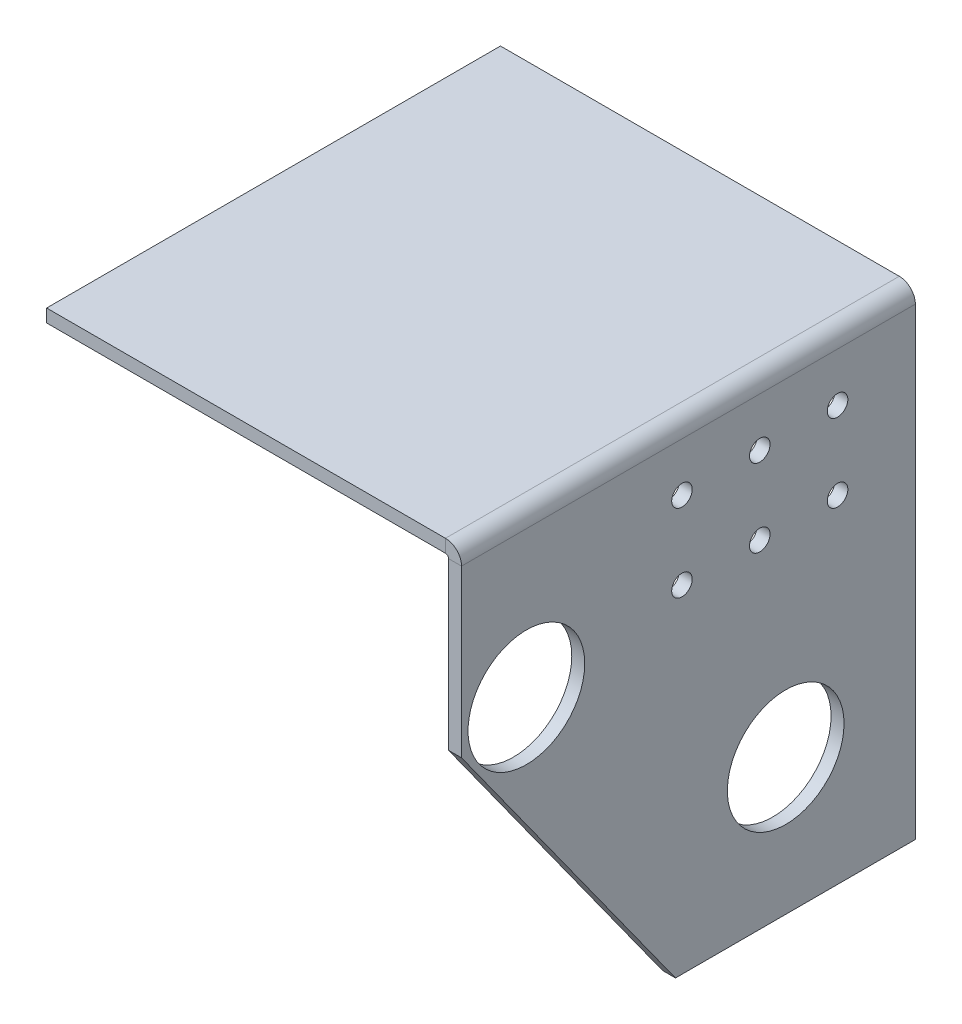
ISO-10303-21;
HEADER;
FILE_DESCRIPTION(('STEP AP214'),'2;1');
FILE_NAME('part.step','',(''),(''),'','','');
FILE_SCHEMA(('AUTOMOTIVE_DESIGN { 1 0 10303 214 1 1 1 1 }'));
ENDSEC;
DATA;
#1=APPLICATION_CONTEXT('core data for automotive mechanical design processes');
#2=APPLICATION_PROTOCOL_DEFINITION('international standard','automotive_design',2000,#1);
#3=PRODUCT_CONTEXT('',#1,'mechanical');
#4=PRODUCT('Part','Part','',(#3));
#5=PRODUCT_RELATED_PRODUCT_CATEGORY('part','',(#4));
#6=PRODUCT_DEFINITION_FORMATION('','',#4);
#7=PRODUCT_DEFINITION_CONTEXT('part definition',#1,'design');
#8=PRODUCT_DEFINITION('design','',#6,#7);
#9=PRODUCT_DEFINITION_SHAPE('','',#8);
#10=(LENGTH_UNIT() NAMED_UNIT(*) SI_UNIT(.MILLI.,.METRE.));
#11=(NAMED_UNIT(*) PLANE_ANGLE_UNIT() SI_UNIT($,.RADIAN.));
#12=(NAMED_UNIT(*) SI_UNIT($,.STERADIAN.) SOLID_ANGLE_UNIT());
#13=UNCERTAINTY_MEASURE_WITH_UNIT(LENGTH_MEASURE(1.E-05),#10,'distance_accuracy_value','');
#14=(GEOMETRIC_REPRESENTATION_CONTEXT(3) GLOBAL_UNCERTAINTY_ASSIGNED_CONTEXT((#13)) GLOBAL_UNIT_ASSIGNED_CONTEXT((#10,
#11,#12)) REPRESENTATION_CONTEXT('',''));
#15=CARTESIAN_POINT('',(0.,0.,0.));
#16=DIRECTION('',(0.,0.,1.));
#17=DIRECTION('',(1.,0.,0.));
#18=AXIS2_PLACEMENT_3D('',#15,#16,#17);
#19=CARTESIAN_POINT('',(101.6,-3.937,111.125));
#20=DIRECTION('',(0.,0.,1.));
#21=DIRECTION('',(1.,0.,0.));
#22=AXIS2_PLACEMENT_3D('',#19,#20,#21);
#23=PLANE('',#22);
#24=DIRECTION('',(-1.,0.,0.));
#25=VECTOR('',#24,1.);
#26=CARTESIAN_POINT('',(101.6,-3.937,111.125));
#27=LINE('',#26,#25);
#28=CARTESIAN_POINT('',(101.6,-3.937,111.125));
#29=VERTEX_POINT('',#28);
#30=CARTESIAN_POINT('',(98.425,-3.937,111.125));
#31=VERTEX_POINT('',#30);
#32=EDGE_CURVE('E11',#29,#31,#27,.T.);
#33=ORIENTED_EDGE('',*,*,#32,.F.);
#34=CARTESIAN_POINT('',(97.663,-3.937,111.125));
#35=DIRECTION('',(0.,0.,1.));
#36=DIRECTION('',(1.,0.,0.));
#37=AXIS2_PLACEMENT_3D('',#34,#35,#36);
#38=CIRCLE('',#37,3.937);
#39=CARTESIAN_POINT('',(97.663,0.,111.125));
#40=VERTEX_POINT('',#39);
#41=EDGE_CURVE('E145',#40,#29,#38,.F.);
#42=ORIENTED_EDGE('',*,*,#41,.F.);
#43=DIRECTION('',(0.,1.,0.));
#44=VECTOR('',#43,1.);
#45=CARTESIAN_POINT('',(97.663,-3.175,111.125));
#46=LINE('',#45,#44);
#47=CARTESIAN_POINT('',(97.663,-3.175,111.125));
#48=VERTEX_POINT('',#47);
#49=EDGE_CURVE('E52',#48,#40,#46,.T.);
#50=ORIENTED_EDGE('',*,*,#49,.F.);
#51=CARTESIAN_POINT('',(97.663,-3.937,111.125));
#52=DIRECTION('',(0.,0.,1.));
#53=DIRECTION('',(1.,0.,0.));
#54=AXIS2_PLACEMENT_3D('',#51,#52,#53);
#55=CIRCLE('',#54,0.762);
#56=EDGE_CURVE('E138',#48,#31,#55,.F.);
#57=ORIENTED_EDGE('',*,*,#56,.T.);
#58=EDGE_LOOP('',(#33,#42,#50,#57));
#59=FACE_BOUND('',#58,.T.);
#60=ADVANCED_FACE('F45',(#59),#23,.T.);
#61=CARTESIAN_POINT('',(97.663,-3.175,111.125));
#62=DIRECTION('',(0.,0.,1.));
#63=DIRECTION('',(1.,0.,0.));
#64=AXIS2_PLACEMENT_3D('',#61,#62,#63);
#65=PLANE('',#64);
#66=DIRECTION('',(1.,0.,0.));
#67=VECTOR('',#66,1.);
#68=CARTESIAN_POINT('',(0.,-44.5925899939614,111.125));
#69=LINE('',#68,#67);
#70=CARTESIAN_POINT('',(98.425,-44.5925899939614,111.125));
#71=VERTEX_POINT('',#70);
#72=CARTESIAN_POINT('',(101.6,-44.5925899939614,111.125));
#73=VERTEX_POINT('',#72);
#74=EDGE_CURVE('E564',#71,#73,#69,.T.);
#75=ORIENTED_EDGE('',*,*,#74,.T.);
#76=DIRECTION('',(0.,-1.,0.));
#77=VECTOR('',#76,1.);
#78=CARTESIAN_POINT('',(101.6,0.,111.125));
#79=LINE('',#78,#77);
#80=EDGE_CURVE('E195',#29,#73,#79,.T.);
#81=ORIENTED_EDGE('',*,*,#80,.F.);
#82=ORIENTED_EDGE('',*,*,#32,.T.);
#83=DIRECTION('',(0.,-1.,0.));
#84=VECTOR('',#83,1.);
#85=CARTESIAN_POINT('',(98.425,0.,111.125));
#86=LINE('',#85,#84);
#87=EDGE_CURVE('E171',#31,#71,#86,.T.);
#88=ORIENTED_EDGE('',*,*,#87,.T.);
#89=EDGE_LOOP('',(#75,#81,#82,#88));
#90=FACE_BOUND('',#89,.T.);
#91=ADVANCED_FACE('F204',(#90),#65,.T.);
#92=CARTESIAN_POINT('',(97.663,0.,0.));
#93=DIRECTION('',(0.,0.,-1.));
#94=DIRECTION('',(-1.,0.,0.));
#95=AXIS2_PLACEMENT_3D('',#92,#93,#94);
#96=PLANE('',#95);
#97=DIRECTION('',(0.,-1.,0.));
#98=VECTOR('',#97,1.);
#99=CARTESIAN_POINT('',(97.663,0.,0.));
#100=LINE('',#99,#98);
#101=CARTESIAN_POINT('',(97.663,0.,0.));
#102=VERTEX_POINT('',#101);
#103=CARTESIAN_POINT('',(97.663,-3.175,0.));
#104=VERTEX_POINT('',#103);
#105=EDGE_CURVE('E187',#102,#104,#100,.T.);
#106=ORIENTED_EDGE('',*,*,#105,.F.);
#107=CARTESIAN_POINT('',(97.663,-3.937,0.));
#108=DIRECTION('',(0.,0.,1.));
#109=DIRECTION('',(1.,0.,0.));
#110=AXIS2_PLACEMENT_3D('',#107,#108,#109);
#111=CIRCLE('',#110,3.937);
#112=CARTESIAN_POINT('',(101.6,-3.937,0.));
#113=VERTEX_POINT('',#112);
#114=EDGE_CURVE('E161',#102,#113,#111,.F.);
#115=ORIENTED_EDGE('',*,*,#114,.T.);
#116=DIRECTION('',(1.,0.,0.));
#117=VECTOR('',#116,1.);
#118=CARTESIAN_POINT('',(98.425,-3.937,0.));
#119=LINE('',#118,#117);
#120=CARTESIAN_POINT('',(98.425,-3.937,0.));
#121=VERTEX_POINT('',#120);
#122=EDGE_CURVE('E100',#121,#113,#119,.T.);
#123=ORIENTED_EDGE('',*,*,#122,.F.);
#124=CARTESIAN_POINT('',(97.663,-3.937,0.));
#125=DIRECTION('',(0.,0.,1.));
#126=DIRECTION('',(1.,0.,0.));
#127=AXIS2_PLACEMENT_3D('',#124,#125,#126);
#128=CIRCLE('',#127,0.762);
#129=EDGE_CURVE('E169',#104,#121,#128,.F.);
#130=ORIENTED_EDGE('',*,*,#129,.F.);
#131=EDGE_LOOP('',(#106,#115,#123,#130));
#132=FACE_BOUND('',#131,.T.);
#133=ADVANCED_FACE('F202',(#132),#96,.T.);
#134=CARTESIAN_POINT('',(98.425,-3.937,0.));
#135=DIRECTION('',(0.,0.,-1.));
#136=DIRECTION('',(-1.,0.,0.));
#137=AXIS2_PLACEMENT_3D('',#134,#135,#136);
#138=PLANE('',#137);
#139=DIRECTION('',(1.,0.,0.));
#140=VECTOR('',#139,1.);
#141=CARTESIAN_POINT('',(0.,0.,0.));
#142=LINE('',#141,#140);
#143=CARTESIAN_POINT('',(0.,0.,0.));
#144=VERTEX_POINT('',#143);
#145=EDGE_CURVE('E163',#144,#102,#142,.T.);
#146=ORIENTED_EDGE('',*,*,#145,.T.);
#147=ORIENTED_EDGE('',*,*,#105,.T.);
#148=DIRECTION('',(1.,0.,0.));
#149=VECTOR('',#148,1.);
#150=CARTESIAN_POINT('',(0.,-3.175,0.));
#151=LINE('',#150,#149);
#152=CARTESIAN_POINT('',(0.,-3.175,0.));
#153=VERTEX_POINT('',#152);
#154=EDGE_CURVE('E167',#153,#104,#151,.T.);
#155=ORIENTED_EDGE('',*,*,#154,.F.);
#156=DIRECTION('',(0.,1.,0.));
#157=VECTOR('',#156,1.);
#158=CARTESIAN_POINT('',(0.,-3.175,0.));
#159=LINE('',#158,#157);
#160=EDGE_CURVE('E124',#153,#144,#159,.T.);
#161=ORIENTED_EDGE('',*,*,#160,.T.);
#162=EDGE_LOOP('',(#146,#147,#155,#161));
#163=FACE_BOUND('',#162,.T.);
#164=ADVANCED_FACE('F198',(#163),#138,.T.);
#165=CARTESIAN_POINT('',(98.425,0.,111.125));
#166=DIRECTION('',(1.,0.,0.));
#167=DIRECTION('',(0.,1.,0.));
#168=AXIS2_PLACEMENT_3D('',#165,#166,#167);
#169=PLANE('',#168);
#170=CARTESIAN_POINT('',(98.425,-15.875,57.15));
#171=DIRECTION('',(1.,0.,0.));
#172=DIRECTION('',(0.,1.,0.));
#173=AXIS2_PLACEMENT_3D('',#170,#171,#172);
#174=CIRCLE('',#173,2.51460000000001);
#175=CARTESIAN_POINT('',(98.425,-13.3604,57.15));
#176=VERTEX_POINT('',#175);
#177=EDGE_CURVE('E155',#176,#176,#174,.T.);
#178=ORIENTED_EDGE('',*,*,#177,.T.);
#179=EDGE_LOOP('',(#178));
#180=FACE_BOUND('',#179,.T.);
#181=CARTESIAN_POINT('',(98.425,-34.925,38.1));
#182=DIRECTION('',(1.,0.,0.));
#183=DIRECTION('',(0.,1.,0.));
#184=AXIS2_PLACEMENT_3D('',#181,#182,#183);
#185=CIRCLE('',#184,2.51460000000001);
#186=CARTESIAN_POINT('',(98.425,-32.4104,38.1));
#187=VERTEX_POINT('',#186);
#188=EDGE_CURVE('E518',#187,#187,#185,.T.);
#189=ORIENTED_EDGE('',*,*,#188,.T.);
#190=EDGE_LOOP('',(#189));
#191=FACE_BOUND('',#190,.T.);
#192=CARTESIAN_POINT('',(98.425,-15.875,38.1));
#193=DIRECTION('',(1.,0.,0.));
#194=DIRECTION('',(0.,1.,0.));
#195=AXIS2_PLACEMENT_3D('',#192,#193,#194);
#196=CIRCLE('',#195,2.51460000000001);
#197=CARTESIAN_POINT('',(98.425,-13.3604,38.1));
#198=VERTEX_POINT('',#197);
#199=EDGE_CURVE('E521',#198,#198,#196,.T.);
#200=ORIENTED_EDGE('',*,*,#199,.T.);
#201=EDGE_LOOP('',(#200));
#202=FACE_BOUND('',#201,.T.);
#203=CARTESIAN_POINT('',(98.425,-39.6875,95.25));
#204=DIRECTION('',(1.,0.,0.));
#205=DIRECTION('',(0.,1.,0.));
#206=AXIS2_PLACEMENT_3D('',#203,#204,#205);
#207=CIRCLE('',#206,14.2875);
#208=CARTESIAN_POINT('',(98.425,-25.4,95.25));
#209=VERTEX_POINT('',#208);
#210=EDGE_CURVE('E524',#209,#209,#207,.T.);
#211=ORIENTED_EDGE('',*,*,#210,.T.);
#212=EDGE_LOOP('',(#211));
#213=FACE_BOUND('',#212,.T.);
#214=CARTESIAN_POINT('',(98.425,-34.925,19.05));
#215=DIRECTION('',(1.,0.,0.));
#216=DIRECTION('',(0.,1.,0.));
#217=AXIS2_PLACEMENT_3D('',#214,#215,#216);
#218=CIRCLE('',#217,2.51460000000001);
#219=CARTESIAN_POINT('',(98.425,-32.4104,19.05));
#220=VERTEX_POINT('',#219);
#221=EDGE_CURVE('E528',#220,#220,#218,.T.);
#222=ORIENTED_EDGE('',*,*,#221,.T.);
#223=EDGE_LOOP('',(#222));
#224=FACE_BOUND('',#223,.T.);
#225=CARTESIAN_POINT('',(98.425,-15.875,19.05));
#226=DIRECTION('',(1.,0.,0.));
#227=DIRECTION('',(0.,1.,0.));
#228=AXIS2_PLACEMENT_3D('',#225,#226,#227);
#229=CIRCLE('',#228,2.51460000000001);
#230=CARTESIAN_POINT('',(98.425,-13.3604,19.05));
#231=VERTEX_POINT('',#230);
#232=EDGE_CURVE('E531',#231,#231,#229,.T.);
#233=ORIENTED_EDGE('',*,*,#232,.T.);
#234=EDGE_LOOP('',(#233));
#235=FACE_BOUND('',#234,.T.);
#236=CARTESIAN_POINT('',(98.425,-34.925,57.15));
#237=DIRECTION('',(1.,0.,0.));
#238=DIRECTION('',(0.,1.,0.));
#239=AXIS2_PLACEMENT_3D('',#236,#237,#238);
#240=CIRCLE('',#239,2.51460000000001);
#241=CARTESIAN_POINT('',(98.425,-32.4104,57.15));
#242=VERTEX_POINT('',#241);
#243=EDGE_CURVE('E534',#242,#242,#240,.T.);
#244=ORIENTED_EDGE('',*,*,#243,.T.);
#245=EDGE_LOOP('',(#244));
#246=FACE_BOUND('',#245,.T.);
#247=CARTESIAN_POINT('',(98.425,-84.1375,31.75));
#248=DIRECTION('',(1.,0.,0.));
#249=DIRECTION('',(0.,1.,0.));
#250=AXIS2_PLACEMENT_3D('',#247,#248,#249);
#251=CIRCLE('',#250,14.2875);
#252=CARTESIAN_POINT('',(98.425,-69.85,31.75));
#253=VERTEX_POINT('',#252);
#254=EDGE_CURVE('E537',#253,#253,#251,.T.);
#255=ORIENTED_EDGE('',*,*,#254,.T.);
#256=EDGE_LOOP('',(#255));
#257=FACE_BOUND('',#256,.T.);
#258=DIRECTION('',(0.,0.,-1.));
#259=VECTOR('',#258,1.);
#260=CARTESIAN_POINT('',(98.425,-117.475,111.125));
#261=LINE('',#260,#259);
#262=CARTESIAN_POINT('',(98.425,-117.475,58.7374999999999));
#263=VERTEX_POINT('',#262);
#264=CARTESIAN_POINT('',(98.425,-117.475,0.));
#265=VERTEX_POINT('',#264);
#266=EDGE_CURVE('E184',#263,#265,#261,.T.);
#267=ORIENTED_EDGE('',*,*,#266,.F.);
#268=DIRECTION('',(0.,0.811998116772744,0.583660053762049));
#269=VECTOR('',#268,1.);
#270=CARTESIAN_POINT('',(98.425,-15.1908697170658,132.258804725698));
#271=LINE('',#270,#269);
#272=EDGE_CURVE('E510',#263,#71,#271,.T.);
#273=ORIENTED_EDGE('',*,*,#272,.T.);
#274=ORIENTED_EDGE('',*,*,#87,.F.);
#275=DIRECTION('',(0.,0.,-1.));
#276=VECTOR('',#275,1.);
#277=CARTESIAN_POINT('',(98.425,-3.937,111.125));
#278=LINE('',#277,#276);
#279=EDGE_CURVE('E150',#31,#121,#278,.T.);
#280=ORIENTED_EDGE('',*,*,#279,.T.);
#281=DIRECTION('',(0.,-1.,0.));
#282=VECTOR('',#281,1.);
#283=CARTESIAN_POINT('',(98.425,0.,0.));
#284=LINE('',#283,#282);
#285=EDGE_CURVE('E151',#121,#265,#284,.T.);
#286=ORIENTED_EDGE('',*,*,#285,.T.);
#287=EDGE_LOOP('',(#267,#273,#274,#280,#286));
#288=FACE_BOUND('',#287,.T.);
#289=ADVANCED_FACE('F210',(#180,#191,#202,#213,#224,#235,#246,#257,#288),#169,.F.);
#290=CARTESIAN_POINT('',(101.6,-117.475,111.125));
#291=DIRECTION('',(0.,-1.,0.));
#292=DIRECTION('',(0.,0.,-1.));
#293=AXIS2_PLACEMENT_3D('',#290,#291,#292);
#294=PLANE('',#293);
#295=DIRECTION('',(1.,0.,0.));
#296=VECTOR('',#295,1.);
#297=CARTESIAN_POINT('',(0.,-117.475,58.7374999999999));
#298=LINE('',#297,#296);
#299=CARTESIAN_POINT('',(101.6,-117.475,58.7374999999999));
#300=VERTEX_POINT('',#299);
#301=EDGE_CURVE('E59',#263,#300,#298,.T.);
#302=ORIENTED_EDGE('',*,*,#301,.F.);
#303=ORIENTED_EDGE('',*,*,#266,.T.);
#304=DIRECTION('',(-1.,0.,0.));
#305=VECTOR('',#304,1.);
#306=CARTESIAN_POINT('',(101.6,-117.475,0.));
#307=LINE('',#306,#305);
#308=CARTESIAN_POINT('',(101.6,-117.475,0.));
#309=VERTEX_POINT('',#308);
#310=EDGE_CURVE('E154',#309,#265,#307,.T.);
#311=ORIENTED_EDGE('',*,*,#310,.F.);
#312=DIRECTION('',(0.,0.,-1.));
#313=VECTOR('',#312,1.);
#314=CARTESIAN_POINT('',(101.6,-117.475,111.125));
#315=LINE('',#314,#313);
#316=EDGE_CURVE('E182',#300,#309,#315,.T.);
#317=ORIENTED_EDGE('',*,*,#316,.F.);
#318=EDGE_LOOP('',(#302,#303,#311,#317));
#319=FACE_BOUND('',#318,.T.);
#320=ADVANCED_FACE('F236',(#319),#294,.T.);
#321=CARTESIAN_POINT('',(101.6,0.,111.125));
#322=DIRECTION('',(1.,0.,0.));
#323=DIRECTION('',(0.,1.,0.));
#324=AXIS2_PLACEMENT_3D('',#321,#322,#323);
#325=PLANE('',#324);
#326=CARTESIAN_POINT('',(101.6,-15.875,57.15));
#327=DIRECTION('',(1.,0.,0.));
#328=DIRECTION('',(0.,0.,-1.));
#329=AXIS2_PLACEMENT_3D('',#326,#327,#328);
#330=CIRCLE('',#329,2.51460000000001);
#331=CARTESIAN_POINT('',(101.6,-15.875,54.6354));
#332=VERTEX_POINT('',#331);
#333=EDGE_CURVE('E550',#332,#332,#330,.T.);
#334=ORIENTED_EDGE('',*,*,#333,.F.);
#335=EDGE_LOOP('',(#334));
#336=FACE_BOUND('',#335,.T.);
#337=CARTESIAN_POINT('',(101.6,-34.925,38.1));
#338=DIRECTION('',(1.,0.,0.));
#339=DIRECTION('',(0.,0.,-1.));
#340=AXIS2_PLACEMENT_3D('',#337,#338,#339);
#341=CIRCLE('',#340,2.51460000000001);
#342=CARTESIAN_POINT('',(101.6,-34.925,35.5854));
#343=VERTEX_POINT('',#342);
#344=EDGE_CURVE('E547',#343,#343,#341,.T.);
#345=ORIENTED_EDGE('',*,*,#344,.F.);
#346=EDGE_LOOP('',(#345));
#347=FACE_BOUND('',#346,.T.);
#348=CARTESIAN_POINT('',(101.6,-15.875,38.1));
#349=DIRECTION('',(1.,0.,0.));
#350=DIRECTION('',(0.,0.,-1.));
#351=AXIS2_PLACEMENT_3D('',#348,#349,#350);
#352=CIRCLE('',#351,2.51460000000001);
#353=CARTESIAN_POINT('',(101.6,-15.875,35.5854));
#354=VERTEX_POINT('',#353);
#355=EDGE_CURVE('E544',#354,#354,#352,.T.);
#356=ORIENTED_EDGE('',*,*,#355,.F.);
#357=EDGE_LOOP('',(#356));
#358=FACE_BOUND('',#357,.T.);
#359=CARTESIAN_POINT('',(101.6,-39.6875,95.25));
#360=DIRECTION('',(1.,0.,0.));
#361=DIRECTION('',(0.,0.,-1.));
#362=AXIS2_PLACEMENT_3D('',#359,#360,#361);
#363=CIRCLE('',#362,14.2875);
#364=CARTESIAN_POINT('',(101.6,-39.6875,80.9625));
#365=VERTEX_POINT('',#364);
#366=EDGE_CURVE('E543',#365,#365,#363,.T.);
#367=ORIENTED_EDGE('',*,*,#366,.F.);
#368=EDGE_LOOP('',(#367));
#369=FACE_BOUND('',#368,.T.);
#370=DIRECTION('',(0.,0.811998116772744,0.583660053762049));
#371=VECTOR('',#370,1.);
#372=CARTESIAN_POINT('',(101.6,-117.475,58.7374999999999));
#373=LINE('',#372,#371);
#374=EDGE_CURVE('E562',#300,#73,#373,.T.);
#375=ORIENTED_EDGE('',*,*,#374,.F.);
#376=ORIENTED_EDGE('',*,*,#316,.T.);
#377=DIRECTION('',(0.,-1.,0.));
#378=VECTOR('',#377,1.);
#379=CARTESIAN_POINT('',(101.6,0.,0.));
#380=LINE('',#379,#378);
#381=EDGE_CURVE('E158',#113,#309,#380,.T.);
#382=ORIENTED_EDGE('',*,*,#381,.F.);
#383=DIRECTION('',(0.,0.,-1.));
#384=VECTOR('',#383,1.);
#385=CARTESIAN_POINT('',(101.6,-3.937,111.125));
#386=LINE('',#385,#384);
#387=EDGE_CURVE('E179',#29,#113,#386,.T.);
#388=ORIENTED_EDGE('',*,*,#387,.F.);
#389=ORIENTED_EDGE('',*,*,#80,.T.);
#390=EDGE_LOOP('',(#375,#376,#382,#388,#389));
#391=FACE_BOUND('',#390,.T.);
#392=CARTESIAN_POINT('',(101.6,-34.925,19.05));
#393=DIRECTION('',(1.,0.,0.));
#394=DIRECTION('',(0.,0.,-1.));
#395=AXIS2_PLACEMENT_3D('',#392,#393,#394);
#396=CIRCLE('',#395,2.51460000000001);
#397=CARTESIAN_POINT('',(101.6,-34.925,16.5354));
#398=VERTEX_POINT('',#397);
#399=EDGE_CURVE('E559',#398,#398,#396,.T.);
#400=ORIENTED_EDGE('',*,*,#399,.F.);
#401=EDGE_LOOP('',(#400));
#402=FACE_BOUND('',#401,.T.);
#403=CARTESIAN_POINT('',(101.6,-15.875,19.05));
#404=DIRECTION('',(1.,0.,0.));
#405=DIRECTION('',(0.,0.,-1.));
#406=AXIS2_PLACEMENT_3D('',#403,#404,#405);
#407=CIRCLE('',#406,2.51460000000001);
#408=CARTESIAN_POINT('',(101.6,-15.875,16.5354));
#409=VERTEX_POINT('',#408);
#410=EDGE_CURVE('E556',#409,#409,#407,.T.);
#411=ORIENTED_EDGE('',*,*,#410,.F.);
#412=EDGE_LOOP('',(#411));
#413=FACE_BOUND('',#412,.T.);
#414=CARTESIAN_POINT('',(101.6,-34.925,57.15));
#415=DIRECTION('',(1.,0.,0.));
#416=DIRECTION('',(0.,0.,-1.));
#417=AXIS2_PLACEMENT_3D('',#414,#415,#416);
#418=CIRCLE('',#417,2.51460000000001);
#419=CARTESIAN_POINT('',(101.6,-34.925,54.6354));
#420=VERTEX_POINT('',#419);
#421=EDGE_CURVE('E553',#420,#420,#418,.T.);
#422=ORIENTED_EDGE('',*,*,#421,.F.);
#423=EDGE_LOOP('',(#422));
#424=FACE_BOUND('',#423,.T.);
#425=CARTESIAN_POINT('',(101.6,-84.1375,31.75));
#426=DIRECTION('',(1.,0.,0.));
#427=DIRECTION('',(0.,0.,-1.));
#428=AXIS2_PLACEMENT_3D('',#425,#426,#427);
#429=CIRCLE('',#428,14.2875);
#430=CARTESIAN_POINT('',(101.6,-84.1375,17.4625));
#431=VERTEX_POINT('',#430);
#432=EDGE_CURVE('E540',#431,#431,#429,.T.);
#433=ORIENTED_EDGE('',*,*,#432,.F.);
#434=EDGE_LOOP('',(#433));
#435=FACE_BOUND('',#434,.T.);
#436=ADVANCED_FACE('F248',(#336,#347,#358,#369,#391,#402,#413,#424,#435),#325,.T.);
#437=CARTESIAN_POINT('',(97.663,-3.937,111.125));
#438=DIRECTION('',(0.,0.,-1.));
#439=DIRECTION('',(-1.,0.,0.));
#440=AXIS2_PLACEMENT_3D('',#437,#438,#439);
#441=CYLINDRICAL_SURFACE('',#440,3.937);
#442=ORIENTED_EDGE('',*,*,#114,.F.);
#443=DIRECTION('',(0.,0.,-1.));
#444=VECTOR('',#443,1.);
#445=CARTESIAN_POINT('',(97.663,0.,111.125));
#446=LINE('',#445,#444);
#447=EDGE_CURVE('E176',#40,#102,#446,.T.);
#448=ORIENTED_EDGE('',*,*,#447,.F.);
#449=ORIENTED_EDGE('',*,*,#41,.T.);
#450=ORIENTED_EDGE('',*,*,#387,.T.);
#451=EDGE_LOOP('',(#442,#448,#449,#450));
#452=FACE_BOUND('',#451,.T.);
#453=ADVANCED_FACE('F192',(#452),#441,.T.);
#454=CARTESIAN_POINT('',(0.,0.,111.125));
#455=DIRECTION('',(0.,1.,0.));
#456=DIRECTION('',(0.,0.,1.));
#457=AXIS2_PLACEMENT_3D('',#454,#455,#456);
#458=PLANE('',#457);
#459=ORIENTED_EDGE('',*,*,#145,.F.);
#460=DIRECTION('',(0.,0.,-1.));
#461=VECTOR('',#460,1.);
#462=CARTESIAN_POINT('',(0.,0.,111.125));
#463=LINE('',#462,#461);
#464=CARTESIAN_POINT('',(0.,0.,111.125));
#465=VERTEX_POINT('',#464);
#466=EDGE_CURVE('E128',#465,#144,#463,.T.);
#467=ORIENTED_EDGE('',*,*,#466,.F.);
#468=DIRECTION('',(1.,0.,0.));
#469=VECTOR('',#468,1.);
#470=CARTESIAN_POINT('',(0.,0.,111.125));
#471=LINE('',#470,#469);
#472=EDGE_CURVE('E143',#465,#40,#471,.T.);
#473=ORIENTED_EDGE('',*,*,#472,.T.);
#474=ORIENTED_EDGE('',*,*,#447,.T.);
#475=EDGE_LOOP('',(#459,#467,#473,#474));
#476=FACE_BOUND('',#475,.T.);
#477=ADVANCED_FACE('F196',(#476),#458,.T.);
#478=CARTESIAN_POINT('',(0.,-3.175,111.125));
#479=DIRECTION('',(-1.,0.,0.));
#480=DIRECTION('',(0.,0.,1.));
#481=AXIS2_PLACEMENT_3D('',#478,#479,#480);
#482=PLANE('',#481);
#483=ORIENTED_EDGE('',*,*,#160,.F.);
#484=DIRECTION('',(0.,0.,-1.));
#485=VECTOR('',#484,1.);
#486=CARTESIAN_POINT('',(0.,-3.175,111.125));
#487=LINE('',#486,#485);
#488=CARTESIAN_POINT('',(0.,-3.175,111.125));
#489=VERTEX_POINT('',#488);
#490=EDGE_CURVE('E118',#489,#153,#487,.T.);
#491=ORIENTED_EDGE('',*,*,#490,.F.);
#492=DIRECTION('',(0.,1.,0.));
#493=VECTOR('',#492,1.);
#494=CARTESIAN_POINT('',(0.,-3.175,111.125));
#495=LINE('',#494,#493);
#496=EDGE_CURVE('E122',#489,#465,#495,.T.);
#497=ORIENTED_EDGE('',*,*,#496,.T.);
#498=ORIENTED_EDGE('',*,*,#466,.T.);
#499=EDGE_LOOP('',(#483,#491,#497,#498));
#500=FACE_BOUND('',#499,.T.);
#501=ADVANCED_FACE('F120',(#500),#482,.T.);
#502=CARTESIAN_POINT('',(0.,-3.175,111.125));
#503=DIRECTION('',(0.,1.,0.));
#504=DIRECTION('',(0.,0.,1.));
#505=AXIS2_PLACEMENT_3D('',#502,#503,#504);
#506=PLANE('',#505);
#507=ORIENTED_EDGE('',*,*,#154,.T.);
#508=DIRECTION('',(0.,0.,-1.));
#509=VECTOR('',#508,1.);
#510=CARTESIAN_POINT('',(97.663,-3.175,111.125));
#511=LINE('',#510,#509);
#512=EDGE_CURVE('E129',#48,#104,#511,.T.);
#513=ORIENTED_EDGE('',*,*,#512,.F.);
#514=DIRECTION('',(1.,0.,0.));
#515=VECTOR('',#514,1.);
#516=CARTESIAN_POINT('',(0.,-3.175,111.125));
#517=LINE('',#516,#515);
#518=EDGE_CURVE('E133',#489,#48,#517,.T.);
#519=ORIENTED_EDGE('',*,*,#518,.F.);
#520=ORIENTED_EDGE('',*,*,#490,.T.);
#521=EDGE_LOOP('',(#507,#513,#519,#520));
#522=FACE_BOUND('',#521,.T.);
#523=ADVANCED_FACE('F134',(#522),#506,.F.);
#524=CARTESIAN_POINT('',(97.663,-3.937,111.125));
#525=DIRECTION('',(0.,0.,-1.));
#526=DIRECTION('',(-1.,0.,0.));
#527=AXIS2_PLACEMENT_3D('',#524,#525,#526);
#528=CYLINDRICAL_SURFACE('',#527,0.762);
#529=ORIENTED_EDGE('',*,*,#129,.T.);
#530=ORIENTED_EDGE('',*,*,#279,.F.);
#531=ORIENTED_EDGE('',*,*,#56,.F.);
#532=ORIENTED_EDGE('',*,*,#512,.T.);
#533=EDGE_LOOP('',(#529,#530,#531,#532));
#534=FACE_BOUND('',#533,.T.);
#535=ADVANCED_FACE('F200',(#534),#528,.F.);
#536=CARTESIAN_POINT('',(97.663,-3.937,111.125));
#537=DIRECTION('',(0.,0.,1.));
#538=DIRECTION('',(1.,0.,0.));
#539=AXIS2_PLACEMENT_3D('',#536,#537,#538);
#540=PLANE('',#539);
#541=ORIENTED_EDGE('',*,*,#518,.T.);
#542=ORIENTED_EDGE('',*,*,#49,.T.);
#543=ORIENTED_EDGE('',*,*,#472,.F.);
#544=ORIENTED_EDGE('',*,*,#496,.F.);
#545=EDGE_LOOP('',(#541,#542,#543,#544));
#546=FACE_BOUND('',#545,.T.);
#547=ADVANCED_FACE('F141',(#546),#540,.T.);
#548=CARTESIAN_POINT('',(97.663,-3.937,0.));
#549=DIRECTION('',(0.,0.,1.));
#550=DIRECTION('',(1.,0.,0.));
#551=AXIS2_PLACEMENT_3D('',#548,#549,#550);
#552=PLANE('',#551);
#553=ORIENTED_EDGE('',*,*,#285,.F.);
#554=ORIENTED_EDGE('',*,*,#122,.T.);
#555=ORIENTED_EDGE('',*,*,#381,.T.);
#556=ORIENTED_EDGE('',*,*,#310,.T.);
#557=EDGE_LOOP('',(#553,#554,#555,#556));
#558=FACE_BOUND('',#557,.T.);
#559=ADVANCED_FACE('F227',(#558),#552,.F.);
#560=CARTESIAN_POINT('',(0.,-84.1375,31.75));
#561=DIRECTION('',(1.,0.,0.));
#562=DIRECTION('',(0.,0.,-1.));
#563=AXIS2_PLACEMENT_3D('',#560,#561,#562);
#564=CYLINDRICAL_SURFACE('',#563,14.2875);
#565=ORIENTED_EDGE('',*,*,#432,.T.);
#566=EDGE_LOOP('',(#565));
#567=FACE_BOUND('',#566,.T.);
#568=ORIENTED_EDGE('',*,*,#254,.F.);
#569=EDGE_LOOP('',(#568));
#570=FACE_BOUND('',#569,.T.);
#571=ADVANCED_FACE('F267',(#567,#570),#564,.F.);
#572=CARTESIAN_POINT('',(0.,-34.925,57.15));
#573=DIRECTION('',(1.,0.,0.));
#574=DIRECTION('',(0.,0.,-1.));
#575=AXIS2_PLACEMENT_3D('',#572,#573,#574);
#576=CYLINDRICAL_SURFACE('',#575,2.51460000000001);
#577=ORIENTED_EDGE('',*,*,#421,.T.);
#578=EDGE_LOOP('',(#577));
#579=FACE_BOUND('',#578,.T.);
#580=ORIENTED_EDGE('',*,*,#243,.F.);
#581=EDGE_LOOP('',(#580));
#582=FACE_BOUND('',#581,.T.);
#583=ADVANCED_FACE('F272',(#579,#582),#576,.F.);
#584=CARTESIAN_POINT('',(0.,-15.875,19.05));
#585=DIRECTION('',(1.,0.,0.));
#586=DIRECTION('',(0.,0.,-1.));
#587=AXIS2_PLACEMENT_3D('',#584,#585,#586);
#588=CYLINDRICAL_SURFACE('',#587,2.51460000000001);
#589=ORIENTED_EDGE('',*,*,#410,.T.);
#590=EDGE_LOOP('',(#589));
#591=FACE_BOUND('',#590,.T.);
#592=ORIENTED_EDGE('',*,*,#232,.F.);
#593=EDGE_LOOP('',(#592));
#594=FACE_BOUND('',#593,.T.);
#595=ADVANCED_FACE('F283',(#591,#594),#588,.F.);
#596=CARTESIAN_POINT('',(0.,-34.925,19.05));
#597=DIRECTION('',(1.,0.,0.));
#598=DIRECTION('',(0.,0.,-1.));
#599=AXIS2_PLACEMENT_3D('',#596,#597,#598);
#600=CYLINDRICAL_SURFACE('',#599,2.51460000000001);
#601=ORIENTED_EDGE('',*,*,#399,.T.);
#602=EDGE_LOOP('',(#601));
#603=FACE_BOUND('',#602,.T.);
#604=ORIENTED_EDGE('',*,*,#221,.F.);
#605=EDGE_LOOP('',(#604));
#606=FACE_BOUND('',#605,.T.);
#607=ADVANCED_FACE('F294',(#603,#606),#600,.F.);
#608=CARTESIAN_POINT('',(0.,-117.475,58.7374999999999));
#609=DIRECTION('',(0.,0.583660053762049,-0.811998116772744));
#610=DIRECTION('',(0.,0.811998116772744,0.583660053762049));
#611=AXIS2_PLACEMENT_3D('',#608,#609,#610);
#612=PLANE('',#611);
#613=ORIENTED_EDGE('',*,*,#301,.T.);
#614=ORIENTED_EDGE('',*,*,#374,.T.);
#615=ORIENTED_EDGE('',*,*,#74,.F.);
#616=ORIENTED_EDGE('',*,*,#272,.F.);
#617=EDGE_LOOP('',(#613,#614,#615,#616));
#618=FACE_BOUND('',#617,.T.);
#619=ADVANCED_FACE('F305',(#618),#612,.F.);
#620=CARTESIAN_POINT('',(0.,-39.6875,95.25));
#621=DIRECTION('',(1.,0.,0.));
#622=DIRECTION('',(0.,0.,-1.));
#623=AXIS2_PLACEMENT_3D('',#620,#621,#622);
#624=CYLINDRICAL_SURFACE('',#623,14.2875);
#625=ORIENTED_EDGE('',*,*,#366,.T.);
#626=EDGE_LOOP('',(#625));
#627=FACE_BOUND('',#626,.T.);
#628=ORIENTED_EDGE('',*,*,#210,.F.);
#629=EDGE_LOOP('',(#628));
#630=FACE_BOUND('',#629,.T.);
#631=ADVANCED_FACE('F316',(#627,#630),#624,.F.);
#632=CARTESIAN_POINT('',(0.,-15.875,38.1));
#633=DIRECTION('',(1.,0.,0.));
#634=DIRECTION('',(0.,0.,-1.));
#635=AXIS2_PLACEMENT_3D('',#632,#633,#634);
#636=CYLINDRICAL_SURFACE('',#635,2.51460000000001);
#637=ORIENTED_EDGE('',*,*,#355,.T.);
#638=EDGE_LOOP('',(#637));
#639=FACE_BOUND('',#638,.T.);
#640=ORIENTED_EDGE('',*,*,#199,.F.);
#641=EDGE_LOOP('',(#640));
#642=FACE_BOUND('',#641,.T.);
#643=ADVANCED_FACE('F326',(#639,#642),#636,.F.);
#644=CARTESIAN_POINT('',(0.,-34.925,38.1));
#645=DIRECTION('',(1.,0.,0.));
#646=DIRECTION('',(0.,0.,-1.));
#647=AXIS2_PLACEMENT_3D('',#644,#645,#646);
#648=CYLINDRICAL_SURFACE('',#647,2.51460000000001);
#649=ORIENTED_EDGE('',*,*,#344,.T.);
#650=EDGE_LOOP('',(#649));
#651=FACE_BOUND('',#650,.T.);
#652=ORIENTED_EDGE('',*,*,#188,.F.);
#653=EDGE_LOOP('',(#652));
#654=FACE_BOUND('',#653,.T.);
#655=ADVANCED_FACE('F337',(#651,#654),#648,.F.);
#656=CARTESIAN_POINT('',(0.,-15.875,57.15));
#657=DIRECTION('',(1.,0.,0.));
#658=DIRECTION('',(0.,0.,-1.));
#659=AXIS2_PLACEMENT_3D('',#656,#657,#658);
#660=CYLINDRICAL_SURFACE('',#659,2.51460000000001);
#661=ORIENTED_EDGE('',*,*,#333,.T.);
#662=EDGE_LOOP('',(#661));
#663=FACE_BOUND('',#662,.T.);
#664=ORIENTED_EDGE('',*,*,#177,.F.);
#665=EDGE_LOOP('',(#664));
#666=FACE_BOUND('',#665,.T.);
#667=ADVANCED_FACE('F348',(#663,#666),#660,.F.);
#668=CLOSED_SHELL('',(#60,#91,#133,#164,#289,#320,#436,#453,#477,#501,#523,#535,#547,#559,#571,
#583,#595,#607,#619,#631,#643,#655,#667));
#669=MANIFOLD_SOLID_BREP('B2',#668);
#670=ADVANCED_BREP_SHAPE_REPRESENTATION('',(#18,#669),#14);
#671=SHAPE_DEFINITION_REPRESENTATION(#9,#670);
ENDSEC;
END-ISO-10303-21;
